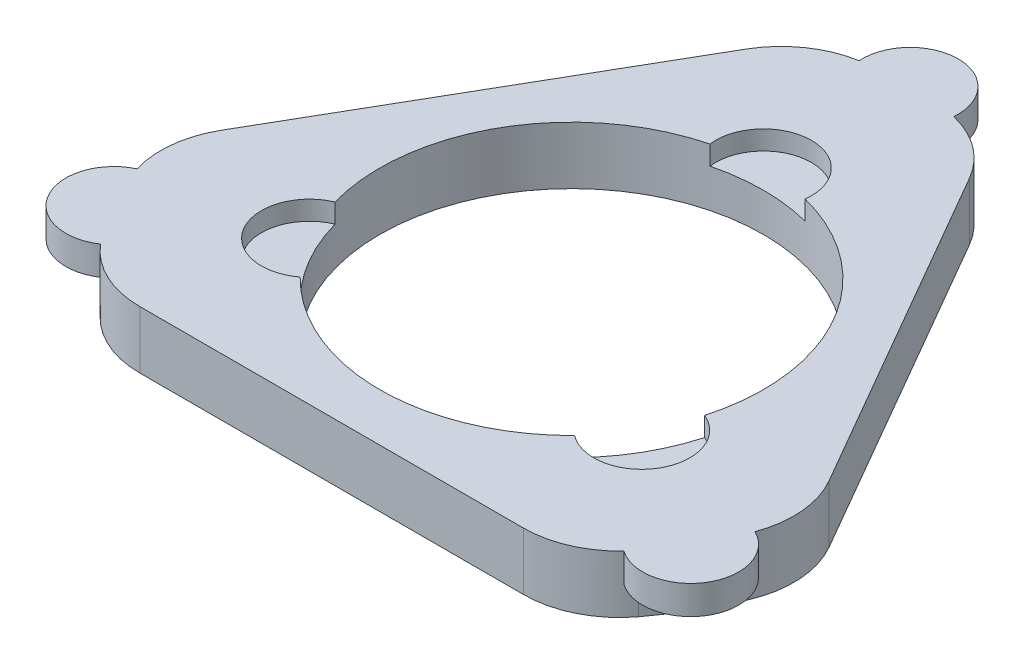
ISO-10303-21;
HEADER;
FILE_DESCRIPTION(('STEP AP214'),'2;1');
FILE_NAME('part.step','',(''),(''),'','','');
FILE_SCHEMA(('AUTOMOTIVE_DESIGN { 1 0 10303 214 1 1 1 1 }'));
ENDSEC;
DATA;
#1=APPLICATION_CONTEXT('core data for automotive mechanical design processes');
#2=APPLICATION_PROTOCOL_DEFINITION('international standard','automotive_design',2000,#1);
#3=PRODUCT_CONTEXT('',#1,'mechanical');
#4=PRODUCT('Part','Part','',(#3));
#5=PRODUCT_RELATED_PRODUCT_CATEGORY('part','',(#4));
#6=PRODUCT_DEFINITION_FORMATION('','',#4);
#7=PRODUCT_DEFINITION_CONTEXT('part definition',#1,'design');
#8=PRODUCT_DEFINITION('design','',#6,#7);
#9=PRODUCT_DEFINITION_SHAPE('','',#8);
#10=(LENGTH_UNIT() NAMED_UNIT(*) SI_UNIT(.MILLI.,.METRE.));
#11=(NAMED_UNIT(*) PLANE_ANGLE_UNIT() SI_UNIT($,.RADIAN.));
#12=(NAMED_UNIT(*) SI_UNIT($,.STERADIAN.) SOLID_ANGLE_UNIT());
#13=UNCERTAINTY_MEASURE_WITH_UNIT(LENGTH_MEASURE(1.E-05),#10,'distance_accuracy_value','');
#14=(GEOMETRIC_REPRESENTATION_CONTEXT(3) GLOBAL_UNCERTAINTY_ASSIGNED_CONTEXT((#13)) GLOBAL_UNIT_ASSIGNED_CONTEXT((#10,
#11,#12)) REPRESENTATION_CONTEXT('',''));
#15=CARTESIAN_POINT('',(0.,0.,0.));
#16=DIRECTION('',(0.,0.,1.));
#17=DIRECTION('',(1.,0.,0.));
#18=AXIS2_PLACEMENT_3D('',#15,#16,#17);
#19=CARTESIAN_POINT('',(0.,6.,0.));
#20=DIRECTION('',(0.,1.,0.));
#21=DIRECTION('',(0.,0.,1.));
#22=AXIS2_PLACEMENT_3D('',#19,#20,#21);
#23=PLANE('',#22);
#24=CARTESIAN_POINT('',(0.,6.,-20.));
#25=DIRECTION('',(0.,1.,0.));
#26=DIRECTION('',(0.,0.,1.));
#27=AXIS2_PLACEMENT_3D('',#24,#25,#26);
#28=CIRCLE('',#27,5.);
#29=CARTESIAN_POINT('',(4.96078370824611,6.,-19.375));
#30=VERTEX_POINT('',#29);
#31=CARTESIAN_POINT('',(-4.96078370824611,6.,-19.375));
#32=VERTEX_POINT('',#31);
#33=EDGE_CURVE('E201',#30,#32,#28,.T.);
#34=ORIENTED_EDGE('',*,*,#33,.F.);
#35=CARTESIAN_POINT('',(0.,6.,0.));
#36=DIRECTION('',(0.,1.,0.));
#37=DIRECTION('',(0.,0.,1.));
#38=AXIS2_PLACEMENT_3D('',#35,#36,#37);
#39=CIRCLE('',#38,20.);
#40=CARTESIAN_POINT('',(19.2596340524469,6.,5.39133528597775));
#41=VERTEX_POINT('',#40);
#42=EDGE_CURVE('E214',#41,#30,#39,.T.);
#43=ORIENTED_EDGE('',*,*,#42,.F.);
#44=CARTESIAN_POINT('',(17.3205080756901,6.,9.99999999999925));
#45=DIRECTION('',(0.,1.,0.));
#46=DIRECTION('',(0.,0.,1.));
#47=AXIS2_PLACEMENT_3D('',#44,#45,#46);
#48=CIRCLE('',#47,5.);
#49=CARTESIAN_POINT('',(14.2988503442014,6.,13.9836647140201));
#50=VERTEX_POINT('',#49);
#51=EDGE_CURVE('E234',#50,#41,#48,.T.);
#52=ORIENTED_EDGE('',*,*,#51,.F.);
#53=CARTESIAN_POINT('',(-14.2988503441995,6.,13.9836647140221));
#54=VERTEX_POINT('',#53);
#55=EDGE_CURVE('E273',#54,#50,#39,.T.);
#56=ORIENTED_EDGE('',*,*,#55,.F.);
#57=CARTESIAN_POINT('',(-17.3205080756875,6.,10.0000000000007));
#58=DIRECTION('',(0.,1.,0.));
#59=DIRECTION('',(0.,0.,1.));
#60=AXIS2_PLACEMENT_3D('',#57,#58,#59);
#61=CIRCLE('',#60,5.);
#62=CARTESIAN_POINT('',(-19.2596340524462,6.,5.39133528598004));
#63=VERTEX_POINT('',#62);
#64=EDGE_CURVE('E222',#63,#54,#61,.T.);
#65=ORIENTED_EDGE('',*,*,#64,.F.);
#66=EDGE_CURVE('E276',#32,#63,#39,.T.);
#67=ORIENTED_EDGE('',*,*,#66,.F.);
#68=EDGE_LOOP('',(#34,#43,#52,#56,#65,#67));
#69=FACE_BOUND('',#68,.T.);
#70=CARTESIAN_POINT('',(-30.4536294819663,6.,17.2504043829445));
#71=DIRECTION('',(0.,1.,0.));
#72=DIRECTION('',(0.,0.,1.));
#73=AXIS2_PLACEMENT_3D('',#70,#71,#72);
#74=CIRCLE('',#73,5.);
#75=CARTESIAN_POINT('',(-32.5618339352836,6.,12.7165898760405));
#76=VERTEX_POINT('',#75);
#77=CARTESIAN_POINT('',(-27.6767457832055,6.,21.4083987219927));
#78=VERTEX_POINT('',#77);
#79=EDGE_CURVE('E256',#76,#78,#74,.T.);
#80=ORIENTED_EDGE('',*,*,#79,.T.);
#81=CARTESIAN_POINT('',(-20.,6.,15.));
#82=DIRECTION('',(0.,1.,0.));
#83=DIRECTION('',(0.,0.,1.));
#84=AXIS2_PLACEMENT_3D('',#81,#82,#83);
#85=CIRCLE('',#84,10.);
#86=CARTESIAN_POINT('',(-20.,6.,25.));
#87=VERTEX_POINT('',#86);
#88=EDGE_CURVE('E343',#78,#87,#85,.T.);
#89=ORIENTED_EDGE('',*,*,#88,.T.);
#90=DIRECTION('',(1.,0.,0.));
#91=VECTOR('',#90,1.);
#92=CARTESIAN_POINT('',(-43.301270189222,6.,25.));
#93=LINE('',#92,#91);
#94=CARTESIAN_POINT('',(20.,6.,25.));
#95=VERTEX_POINT('',#94);
#96=EDGE_CURVE('E245',#87,#95,#93,.T.);
#97=ORIENTED_EDGE('',*,*,#96,.T.);
#98=CARTESIAN_POINT('',(20.,6.,15.));
#99=DIRECTION('',(0.,1.,0.));
#100=DIRECTION('',(0.,0.,1.));
#101=AXIS2_PLACEMENT_3D('',#98,#99,#100);
#102=CIRCLE('',#101,10.);
#103=CARTESIAN_POINT('',(27.2938068498009,6.,21.8410804437455));
#104=VERTEX_POINT('',#103);
#105=EDGE_CURVE('E337',#95,#104,#102,.T.);
#106=ORIENTED_EDGE('',*,*,#105,.T.);
#107=CARTESIAN_POINT('',(30.1661031621676,6.,17.7484145773493));
#108=DIRECTION('',(0.,1.,0.));
#109=DIRECTION('',(0.,0.,1.));
#110=AXIS2_PLACEMENT_3D('',#107,#108,#109);
#111=CIRCLE('',#110,5.);
#112=CARTESIAN_POINT('',(32.3785900391947,6.,13.2645655813434));
#113=VERTEX_POINT('',#112);
#114=EDGE_CURVE('E252',#104,#113,#111,.T.);
#115=ORIENTED_EDGE('',*,*,#114,.T.);
#116=CARTESIAN_POINT('',(22.9903810567666,6.,9.82050807568875));
#117=DIRECTION('',(0.,1.,0.));
#118=DIRECTION('',(0.,0.,1.));
#119=AXIS2_PLACEMENT_3D('',#116,#117,#118);
#120=CIRCLE('',#119,10.);
#121=CARTESIAN_POINT('',(31.650635094611,6.,4.82050807568876));
#122=VERTEX_POINT('',#121);
#123=EDGE_CURVE('E335',#113,#122,#120,.T.);
#124=ORIENTED_EDGE('',*,*,#123,.T.);
#125=DIRECTION('',(-0.5,0.,-0.866025403784438));
#126=VECTOR('',#125,1.);
#127=CARTESIAN_POINT('',(43.301270189222,6.,25.));
#128=LINE('',#127,#126);
#129=CARTESIAN_POINT('',(11.650635094611,6.,-29.8205080756888));
#130=VERTEX_POINT('',#129);
#131=EDGE_CURVE('E216',#122,#130,#128,.T.);
#132=ORIENTED_EDGE('',*,*,#131,.T.);
#133=CARTESIAN_POINT('',(2.9903810567666,6.,-24.8205080756888));
#134=DIRECTION('',(0.,1.,0.));
#135=DIRECTION('',(0.,0.,1.));
#136=AXIS2_PLACEMENT_3D('',#133,#134,#135);
#137=CIRCLE('',#136,10.);
#138=CARTESIAN_POINT('',(5.26802708548266,6.,-34.5576703197861));
#139=VERTEX_POINT('',#138);
#140=EDGE_CURVE('E332',#130,#139,#137,.T.);
#141=ORIENTED_EDGE('',*,*,#140,.T.);
#142=CARTESIAN_POINT('',(0.287526319798734,6.,-34.9988189602938));
#143=DIRECTION('',(0.,1.,0.));
#144=DIRECTION('',(0.,0.,1.));
#145=AXIS2_PLACEMENT_3D('',#142,#143,#144);
#146=CIRCLE('',#145,5.);
#147=CARTESIAN_POINT('',(-4.70184425598925,6.,-34.6729643033361));
#148=VERTEX_POINT('',#147);
#149=EDGE_CURVE('E251',#139,#148,#146,.T.);
#150=ORIENTED_EDGE('',*,*,#149,.T.);
#151=CARTESIAN_POINT('',(-2.99038105676657,6.,-24.8205080756888));
#152=DIRECTION('',(0.,1.,0.));
#153=DIRECTION('',(0.,0.,1.));
#154=AXIS2_PLACEMENT_3D('',#151,#152,#153);
#155=CIRCLE('',#154,10.);
#156=CARTESIAN_POINT('',(-11.650635094611,6.,-29.8205080756888));
#157=VERTEX_POINT('',#156);
#158=EDGE_CURVE('E330',#148,#157,#155,.T.);
#159=ORIENTED_EDGE('',*,*,#158,.T.);
#160=DIRECTION('',(-0.5,0.,0.866025403784438));
#161=VECTOR('',#160,1.);
#162=CARTESIAN_POINT('',(0.,6.,-50.));
#163=LINE('',#162,#161);
#164=CARTESIAN_POINT('',(-31.650635094611,6.,4.82050807568876));
#165=VERTEX_POINT('',#164);
#166=EDGE_CURVE('E242',#157,#165,#163,.T.);
#167=ORIENTED_EDGE('',*,*,#166,.T.);
#168=CARTESIAN_POINT('',(-22.9903810567666,6.,9.82050807568877));
#169=DIRECTION('',(0.,1.,0.));
#170=DIRECTION('',(0.,0.,1.));
#171=AXIS2_PLACEMENT_3D('',#168,#169,#170);
#172=CIRCLE('',#171,10.);
#173=EDGE_CURVE('E340',#165,#76,#172,.T.);
#174=ORIENTED_EDGE('',*,*,#173,.T.);
#175=EDGE_LOOP('',(#80,#89,#97,#106,#115,#124,#132,#141,#150,#159,#167,#174));
#176=FACE_BOUND('',#175,.T.);
#177=ADVANCED_FACE('F37',(#69,#176),#23,.T.);
#178=CARTESIAN_POINT('',(0.,6.,0.));
#179=DIRECTION('',(0.,-1.,0.));
#180=DIRECTION('',(0.,0.,-1.));
#181=AXIS2_PLACEMENT_3D('',#178,#179,#180);
#182=CYLINDRICAL_SURFACE('',#181,35.);
#183=CARTESIAN_POINT('',(0.,3.,0.));
#184=DIRECTION('',(0.,1.,0.));
#185=DIRECTION('',(0.,0.,1.));
#186=AXIS2_PLACEMENT_3D('',#183,#184,#185);
#187=CIRCLE('',#186,35.);
#188=CARTESIAN_POINT('',(28.,3.,21.));
#189=VERTEX_POINT('',#188);
#190=CARTESIAN_POINT('',(32.1865334794732,3.,13.7487113059643));
#191=VERTEX_POINT('',#190);
#192=EDGE_CURVE('E294',#189,#191,#187,.T.);
#193=ORIENTED_EDGE('',*,*,#192,.F.);
#194=DIRECTION('',(0.,-1.,0.));
#195=VECTOR('',#194,1.);
#196=CARTESIAN_POINT('',(28.,6.,21.));
#197=LINE('',#196,#195);
#198=CARTESIAN_POINT('',(28.,0.,21.));
#199=VERTEX_POINT('',#198);
#200=EDGE_CURVE('E353',#189,#199,#197,.T.);
#201=ORIENTED_EDGE('',*,*,#200,.T.);
#202=CARTESIAN_POINT('',(0.,0.,0.));
#203=DIRECTION('',(0.,1.,0.));
#204=DIRECTION('',(0.,0.,1.));
#205=AXIS2_PLACEMENT_3D('',#202,#203,#204);
#206=CIRCLE('',#205,35.);
#207=CARTESIAN_POINT('',(32.1865334794732,0.,13.7487113059643));
#208=VERTEX_POINT('',#207);
#209=EDGE_CURVE('E280',#199,#208,#206,.T.);
#210=ORIENTED_EDGE('',*,*,#209,.T.);
#211=DIRECTION('',(0.,-1.,0.));
#212=VECTOR('',#211,1.);
#213=CARTESIAN_POINT('',(32.1865334794732,6.,13.7487113059643));
#214=LINE('',#213,#212);
#215=EDGE_CURVE('E351',#208,#191,#214,.F.);
#216=ORIENTED_EDGE('',*,*,#215,.T.);
#217=EDGE_LOOP('',(#193,#201,#210,#216));
#218=FACE_BOUND('',#217,.T.);
#219=ADVANCED_FACE('F442',(#218),#182,.T.);
#220=CARTESIAN_POINT('',(0.,3.,0.));
#221=DIRECTION('',(0.,1.,0.));
#222=DIRECTION('',(0.,0.,1.));
#223=AXIS2_PLACEMENT_3D('',#220,#221,#222);
#224=CIRCLE('',#223,35.);
#225=CARTESIAN_POINT('',(4.18653347947323,3.,-34.7487113059643));
#226=VERTEX_POINT('',#225);
#227=CARTESIAN_POINT('',(-4.1865334794732,3.,-34.7487113059643));
#228=VERTEX_POINT('',#227);
#229=EDGE_CURVE('E291',#226,#228,#224,.T.);
#230=ORIENTED_EDGE('',*,*,#229,.F.);
#231=DIRECTION('',(0.,-1.,0.));
#232=VECTOR('',#231,1.);
#233=CARTESIAN_POINT('',(4.18653347947323,6.,-34.7487113059643));
#234=LINE('',#233,#232);
#235=CARTESIAN_POINT('',(4.18653347947323,0.,-34.7487113059643));
#236=VERTEX_POINT('',#235);
#237=EDGE_CURVE('E363',#226,#236,#234,.T.);
#238=ORIENTED_EDGE('',*,*,#237,.T.);
#239=CARTESIAN_POINT('',(-4.1865334794732,0.,-34.7487113059643));
#240=VERTEX_POINT('',#239);
#241=EDGE_CURVE('E277',#236,#240,#206,.T.);
#242=ORIENTED_EDGE('',*,*,#241,.T.);
#243=DIRECTION('',(0.,-1.,0.));
#244=VECTOR('',#243,1.);
#245=CARTESIAN_POINT('',(-4.1865334794732,6.,-34.7487113059643));
#246=LINE('',#245,#244);
#247=EDGE_CURVE('E361',#240,#228,#246,.F.);
#248=ORIENTED_EDGE('',*,*,#247,.T.);
#249=EDGE_LOOP('',(#230,#238,#242,#248));
#250=FACE_BOUND('',#249,.T.);
#251=ADVANCED_FACE('F410',(#250),#182,.T.);
#252=CARTESIAN_POINT('',(-32.1865334794732,0.,13.7487113059643));
#253=VERTEX_POINT('',#252);
#254=CARTESIAN_POINT('',(-28.,0.,21.));
#255=VERTEX_POINT('',#254);
#256=EDGE_CURVE('E281',#253,#255,#206,.T.);
#257=ORIENTED_EDGE('',*,*,#256,.T.);
#258=DIRECTION('',(0.,-1.,0.));
#259=VECTOR('',#258,1.);
#260=CARTESIAN_POINT('',(-28.,6.,21.));
#261=LINE('',#260,#259);
#262=CARTESIAN_POINT('',(-28.,3.,21.));
#263=VERTEX_POINT('',#262);
#264=EDGE_CURVE('E328',#255,#263,#261,.F.);
#265=ORIENTED_EDGE('',*,*,#264,.T.);
#266=CARTESIAN_POINT('',(0.,3.,0.));
#267=DIRECTION('',(0.,1.,0.));
#268=DIRECTION('',(0.,0.,1.));
#269=AXIS2_PLACEMENT_3D('',#266,#267,#268);
#270=CIRCLE('',#269,35.);
#271=CARTESIAN_POINT('',(-32.1865334794732,3.,13.7487113059643));
#272=VERTEX_POINT('',#271);
#273=EDGE_CURVE('E288',#272,#263,#270,.T.);
#274=ORIENTED_EDGE('',*,*,#273,.F.);
#275=DIRECTION('',(0.,-1.,0.));
#276=VECTOR('',#275,1.);
#277=CARTESIAN_POINT('',(-32.1865334794732,6.,13.7487113059643));
#278=LINE('',#277,#276);
#279=EDGE_CURVE('E326',#272,#253,#278,.T.);
#280=ORIENTED_EDGE('',*,*,#279,.T.);
#281=EDGE_LOOP('',(#257,#265,#274,#280));
#282=FACE_BOUND('',#281,.T.);
#283=ADVANCED_FACE('F466',(#282),#182,.T.);
#284=CARTESIAN_POINT('',(0.,0.,0.));
#285=DIRECTION('',(0.,1.,0.));
#286=DIRECTION('',(0.,0.,1.));
#287=AXIS2_PLACEMENT_3D('',#284,#285,#286);
#288=PLANE('',#287);
#289=CARTESIAN_POINT('',(-24.5085189270996,0.,14.15));
#290=DIRECTION('',(0.,1.,0.));
#291=DIRECTION('',(0.,0.,1.));
#292=AXIS2_PLACEMENT_3D('',#289,#290,#291);
#293=CIRCLE('',#292,2.9);
#294=CARTESIAN_POINT('',(-24.5085189270996,0.,17.05));
#295=VERTEX_POINT('',#294);
#296=EDGE_CURVE('E272',#295,#295,#293,.T.);
#297=ORIENTED_EDGE('',*,*,#296,.T.);
#298=EDGE_LOOP('',(#297));
#299=FACE_BOUND('',#298,.T.);
#300=CARTESIAN_POINT('',(24.5085189270996,0.,14.15));
#301=DIRECTION('',(0.,1.,0.));
#302=DIRECTION('',(0.,0.,1.));
#303=AXIS2_PLACEMENT_3D('',#300,#301,#302);
#304=CIRCLE('',#303,2.9);
#305=CARTESIAN_POINT('',(24.5085189270996,0.,17.05));
#306=VERTEX_POINT('',#305);
#307=EDGE_CURVE('E268',#306,#306,#304,.T.);
#308=ORIENTED_EDGE('',*,*,#307,.T.);
#309=EDGE_LOOP('',(#308));
#310=FACE_BOUND('',#309,.T.);
#311=CARTESIAN_POINT('',(0.,0.,-28.3));
#312=DIRECTION('',(0.,1.,0.));
#313=DIRECTION('',(0.,0.,1.));
#314=AXIS2_PLACEMENT_3D('',#311,#312,#313);
#315=CIRCLE('',#314,2.9);
#316=CARTESIAN_POINT('',(0.,0.,-25.4));
#317=VERTEX_POINT('',#316);
#318=EDGE_CURVE('E264',#317,#317,#315,.T.);
#319=ORIENTED_EDGE('',*,*,#318,.T.);
#320=EDGE_LOOP('',(#319));
#321=FACE_BOUND('',#320,.T.);
#322=CARTESIAN_POINT('',(0.,0.,0.));
#323=DIRECTION('',(0.,1.,0.));
#324=DIRECTION('',(0.,0.,1.));
#325=AXIS2_PLACEMENT_3D('',#322,#323,#324);
#326=CIRCLE('',#325,20.);
#327=CARTESIAN_POINT('',(0.,0.,20.));
#328=VERTEX_POINT('',#327);
#329=EDGE_CURVE('E248',#328,#328,#326,.T.);
#330=ORIENTED_EDGE('',*,*,#329,.T.);
#331=EDGE_LOOP('',(#330));
#332=FACE_BOUND('',#331,.T.);
#333=DIRECTION('',(1.,0.,0.));
#334=VECTOR('',#333,1.);
#335=CARTESIAN_POINT('',(0.,0.,25.));
#336=LINE('',#335,#334);
#337=CARTESIAN_POINT('',(-20.,0.,25.));
#338=VERTEX_POINT('',#337);
#339=CARTESIAN_POINT('',(20.,0.,25.));
#340=VERTEX_POINT('',#339);
#341=EDGE_CURVE('E302',#338,#340,#336,.T.);
#342=ORIENTED_EDGE('',*,*,#341,.F.);
#343=CARTESIAN_POINT('',(-20.,0.,15.));
#344=DIRECTION('',(0.,1.,0.));
#345=DIRECTION('',(0.,0.,1.));
#346=AXIS2_PLACEMENT_3D('',#343,#344,#345);
#347=CIRCLE('',#346,10.);
#348=EDGE_CURVE('E324',#338,#255,#347,.F.);
#349=ORIENTED_EDGE('',*,*,#348,.T.);
#350=ORIENTED_EDGE('',*,*,#256,.F.);
#351=CARTESIAN_POINT('',(-22.9903810567666,0.,9.82050807568877));
#352=DIRECTION('',(0.,1.,0.));
#353=DIRECTION('',(0.,0.,1.));
#354=AXIS2_PLACEMENT_3D('',#351,#352,#353);
#355=CIRCLE('',#354,10.);
#356=CARTESIAN_POINT('',(-31.650635094611,0.,4.82050807568878));
#357=VERTEX_POINT('',#356);
#358=EDGE_CURVE('E322',#253,#357,#355,.F.);
#359=ORIENTED_EDGE('',*,*,#358,.T.);
#360=DIRECTION('',(-0.5,0.,0.866025403784439));
#361=VECTOR('',#360,1.);
#362=CARTESIAN_POINT('',(-21.650635094611,0.,-12.5));
#363=LINE('',#362,#361);
#364=CARTESIAN_POINT('',(-11.650635094611,0.,-29.8205080756888));
#365=VERTEX_POINT('',#364);
#366=EDGE_CURVE('E297',#365,#357,#363,.T.);
#367=ORIENTED_EDGE('',*,*,#366,.F.);
#368=CARTESIAN_POINT('',(-2.99038105676657,0.,-24.8205080756888));
#369=DIRECTION('',(0.,1.,0.));
#370=DIRECTION('',(0.,0.,1.));
#371=AXIS2_PLACEMENT_3D('',#368,#369,#370);
#372=CIRCLE('',#371,10.);
#373=EDGE_CURVE('E314',#365,#240,#372,.F.);
#374=ORIENTED_EDGE('',*,*,#373,.T.);
#375=ORIENTED_EDGE('',*,*,#241,.F.);
#376=CARTESIAN_POINT('',(2.9903810567666,0.,-24.8205080756888));
#377=DIRECTION('',(0.,1.,0.));
#378=DIRECTION('',(0.,0.,1.));
#379=AXIS2_PLACEMENT_3D('',#376,#377,#378);
#380=CIRCLE('',#379,10.);
#381=CARTESIAN_POINT('',(11.650635094611,0.,-29.8205080756888));
#382=VERTEX_POINT('',#381);
#383=EDGE_CURVE('E316',#236,#382,#380,.F.);
#384=ORIENTED_EDGE('',*,*,#383,.T.);
#385=DIRECTION('',(-0.5,0.,-0.866025403784439));
#386=VECTOR('',#385,1.);
#387=CARTESIAN_POINT('',(21.650635094611,0.,-12.5));
#388=LINE('',#387,#386);
#389=CARTESIAN_POINT('',(31.650635094611,0.,4.82050807568876));
#390=VERTEX_POINT('',#389);
#391=EDGE_CURVE('E305',#390,#382,#388,.T.);
#392=ORIENTED_EDGE('',*,*,#391,.F.);
#393=CARTESIAN_POINT('',(22.9903810567666,0.,9.82050807568875));
#394=DIRECTION('',(0.,1.,0.));
#395=DIRECTION('',(0.,0.,1.));
#396=AXIS2_PLACEMENT_3D('',#393,#394,#395);
#397=CIRCLE('',#396,10.);
#398=EDGE_CURVE('E318',#390,#208,#397,.F.);
#399=ORIENTED_EDGE('',*,*,#398,.T.);
#400=ORIENTED_EDGE('',*,*,#209,.F.);
#401=CARTESIAN_POINT('',(20.,0.,15.));
#402=DIRECTION('',(0.,1.,0.));
#403=DIRECTION('',(0.,0.,1.));
#404=AXIS2_PLACEMENT_3D('',#401,#402,#403);
#405=CIRCLE('',#404,10.);
#406=EDGE_CURVE('E320',#199,#340,#405,.F.);
#407=ORIENTED_EDGE('',*,*,#406,.T.);
#408=EDGE_LOOP('',(#342,#349,#350,#359,#367,#374,#375,#384,#392,#399,#400,#407));
#409=FACE_BOUND('',#408,.T.);
#410=ADVANCED_FACE('F419',(#299,#310,#321,#332,#409),#288,.F.);
#411=CARTESIAN_POINT('',(0.,6.,0.));
#412=DIRECTION('',(0.,-1.,0.));
#413=DIRECTION('',(0.,0.,-1.));
#414=AXIS2_PLACEMENT_3D('',#411,#412,#413);
#415=CYLINDRICAL_SURFACE('',#414,20.);
#416=DIRECTION('',(0.,1.,0.));
#417=VECTOR('',#416,1.);
#418=CARTESIAN_POINT('',(4.96078370824611,4.,-19.375));
#419=LINE('',#418,#417);
#420=CARTESIAN_POINT('',(4.96078370824611,4.,-19.375));
#421=VERTEX_POINT('',#420);
#422=EDGE_CURVE('E205',#421,#30,#419,.T.);
#423=ORIENTED_EDGE('',*,*,#422,.F.);
#424=CARTESIAN_POINT('',(0.,4.,0.));
#425=DIRECTION('',(0.,1.,0.));
#426=DIRECTION('',(0.,0.,1.));
#427=AXIS2_PLACEMENT_3D('',#424,#425,#426);
#428=CIRCLE('',#427,20.);
#429=CARTESIAN_POINT('',(-4.96078370824611,4.,-19.375));
#430=VERTEX_POINT('',#429);
#431=EDGE_CURVE('E196',#430,#421,#428,.F.);
#432=ORIENTED_EDGE('',*,*,#431,.F.);
#433=DIRECTION('',(0.,1.,0.));
#434=VECTOR('',#433,1.);
#435=CARTESIAN_POINT('',(-4.96078370824611,4.,-19.375));
#436=LINE('',#435,#434);
#437=EDGE_CURVE('E207',#430,#32,#436,.T.);
#438=ORIENTED_EDGE('',*,*,#437,.T.);
#439=ORIENTED_EDGE('',*,*,#66,.T.);
#440=DIRECTION('',(0.,1.,0.));
#441=VECTOR('',#440,1.);
#442=CARTESIAN_POINT('',(-19.2596340524462,4.,5.39133528598004));
#443=LINE('',#442,#441);
#444=CARTESIAN_POINT('',(-19.2596340524462,4.,5.39133528598004));
#445=VERTEX_POINT('',#444);
#446=EDGE_CURVE('E224',#445,#63,#443,.T.);
#447=ORIENTED_EDGE('',*,*,#446,.F.);
#448=CARTESIAN_POINT('',(0.,4.,0.));
#449=DIRECTION('',(0.,1.,0.));
#450=DIRECTION('',(0.,0.,1.));
#451=AXIS2_PLACEMENT_3D('',#448,#449,#450);
#452=CIRCLE('',#451,20.);
#453=CARTESIAN_POINT('',(-14.2988503441995,4.,13.9836647140221));
#454=VERTEX_POINT('',#453);
#455=EDGE_CURVE('E220',#454,#445,#452,.F.);
#456=ORIENTED_EDGE('',*,*,#455,.F.);
#457=DIRECTION('',(0.,1.,0.));
#458=VECTOR('',#457,1.);
#459=CARTESIAN_POINT('',(-14.2988503441995,4.,13.9836647140221));
#460=LINE('',#459,#458);
#461=EDGE_CURVE('E227',#454,#54,#460,.T.);
#462=ORIENTED_EDGE('',*,*,#461,.T.);
#463=ORIENTED_EDGE('',*,*,#55,.T.);
#464=DIRECTION('',(0.,1.,0.));
#465=VECTOR('',#464,1.);
#466=CARTESIAN_POINT('',(14.2988503442014,4.,13.9836647140201));
#467=LINE('',#466,#465);
#468=CARTESIAN_POINT('',(14.2988503442014,4.,13.9836647140201));
#469=VERTEX_POINT('',#468);
#470=EDGE_CURVE('E236',#469,#50,#467,.T.);
#471=ORIENTED_EDGE('',*,*,#470,.F.);
#472=CARTESIAN_POINT('',(0.,4.,0.));
#473=DIRECTION('',(0.,1.,0.));
#474=DIRECTION('',(0.,0.,1.));
#475=AXIS2_PLACEMENT_3D('',#472,#473,#474);
#476=CIRCLE('',#475,20.);
#477=CARTESIAN_POINT('',(19.2596340524469,4.,5.39133528597775));
#478=VERTEX_POINT('',#477);
#479=EDGE_CURVE('E231',#478,#469,#476,.F.);
#480=ORIENTED_EDGE('',*,*,#479,.F.);
#481=DIRECTION('',(0.,1.,0.));
#482=VECTOR('',#481,1.);
#483=CARTESIAN_POINT('',(19.2596340524469,4.,5.39133528597775));
#484=LINE('',#483,#482);
#485=EDGE_CURVE('E226',#478,#41,#484,.T.);
#486=ORIENTED_EDGE('',*,*,#485,.T.);
#487=ORIENTED_EDGE('',*,*,#42,.T.);
#488=EDGE_LOOP('',(#423,#432,#438,#439,#447,#456,#462,#463,#471,#480,#486,#487));
#489=FACE_BOUND('',#488,.T.);
#490=ORIENTED_EDGE('',*,*,#329,.F.);
#491=EDGE_LOOP('',(#490));
#492=FACE_BOUND('',#491,.T.);
#493=ADVANCED_FACE('F210',(#489,#492),#415,.F.);
#494=CARTESIAN_POINT('',(-24.5085189270996,-2.,14.15));
#495=DIRECTION('',(0.,-1.,0.));
#496=DIRECTION('',(0.,0.,-1.));
#497=AXIS2_PLACEMENT_3D('',#494,#495,#496);
#498=PLANE('',#497);
#499=CARTESIAN_POINT('',(-24.5085189270996,-2.,14.15));
#500=DIRECTION('',(0.,-1.,0.));
#501=DIRECTION('',(0.,0.,-1.));
#502=AXIS2_PLACEMENT_3D('',#499,#500,#501);
#503=CIRCLE('',#502,2.9);
#504=CARTESIAN_POINT('',(-24.5085189270996,-2.,11.25));
#505=VERTEX_POINT('',#504);
#506=EDGE_CURVE('E269',#505,#505,#503,.T.);
#507=ORIENTED_EDGE('',*,*,#506,.T.);
#508=EDGE_LOOP('',(#507));
#509=FACE_BOUND('',#508,.T.);
#510=ADVANCED_FACE('F565',(#509),#498,.T.);
#511=CARTESIAN_POINT('',(-24.5085189270996,14.202438661764,14.15));
#512=DIRECTION('',(0.,-1.,0.));
#513=DIRECTION('',(0.,0.,-1.));
#514=AXIS2_PLACEMENT_3D('',#511,#512,#513);
#515=CYLINDRICAL_SURFACE('',#514,2.9);
#516=ORIENTED_EDGE('',*,*,#506,.F.);
#517=EDGE_LOOP('',(#516));
#518=FACE_BOUND('',#517,.T.);
#519=ORIENTED_EDGE('',*,*,#296,.F.);
#520=EDGE_LOOP('',(#519));
#521=FACE_BOUND('',#520,.T.);
#522=ADVANCED_FACE('F560',(#518,#521),#515,.T.);
#523=CARTESIAN_POINT('',(24.5085189270996,-2.,14.15));
#524=DIRECTION('',(0.,-1.,0.));
#525=DIRECTION('',(0.,0.,-1.));
#526=AXIS2_PLACEMENT_3D('',#523,#524,#525);
#527=PLANE('',#526);
#528=CARTESIAN_POINT('',(24.5085189270996,-2.,14.15));
#529=DIRECTION('',(0.,-1.,0.));
#530=DIRECTION('',(0.,0.,-1.));
#531=AXIS2_PLACEMENT_3D('',#528,#529,#530);
#532=CIRCLE('',#531,2.9);
#533=CARTESIAN_POINT('',(24.5085189270996,-2.,11.25));
#534=VERTEX_POINT('',#533);
#535=EDGE_CURVE('E265',#534,#534,#532,.T.);
#536=ORIENTED_EDGE('',*,*,#535,.T.);
#537=EDGE_LOOP('',(#536));
#538=FACE_BOUND('',#537,.T.);
#539=ADVANCED_FACE('F557',(#538),#527,.T.);
#540=CARTESIAN_POINT('',(24.5085189270996,14.202438661764,14.15));
#541=DIRECTION('',(0.,-1.,0.));
#542=DIRECTION('',(0.,0.,-1.));
#543=AXIS2_PLACEMENT_3D('',#540,#541,#542);
#544=CYLINDRICAL_SURFACE('',#543,2.9);
#545=ORIENTED_EDGE('',*,*,#535,.F.);
#546=EDGE_LOOP('',(#545));
#547=FACE_BOUND('',#546,.T.);
#548=ORIENTED_EDGE('',*,*,#307,.F.);
#549=EDGE_LOOP('',(#548));
#550=FACE_BOUND('',#549,.T.);
#551=ADVANCED_FACE('F552',(#547,#550),#544,.T.);
#552=CARTESIAN_POINT('',(0.,-2.,-28.3));
#553=DIRECTION('',(0.,-1.,0.));
#554=DIRECTION('',(0.,0.,-1.));
#555=AXIS2_PLACEMENT_3D('',#552,#553,#554);
#556=PLANE('',#555);
#557=CARTESIAN_POINT('',(0.,-2.,-28.3));
#558=DIRECTION('',(0.,-1.,0.));
#559=DIRECTION('',(0.,0.,-1.));
#560=AXIS2_PLACEMENT_3D('',#557,#558,#559);
#561=CIRCLE('',#560,2.9);
#562=CARTESIAN_POINT('',(0.,-2.,-31.2));
#563=VERTEX_POINT('',#562);
#564=EDGE_CURVE('E260',#563,#563,#561,.T.);
#565=ORIENTED_EDGE('',*,*,#564,.T.);
#566=EDGE_LOOP('',(#565));
#567=FACE_BOUND('',#566,.T.);
#568=ADVANCED_FACE('F549',(#567),#556,.T.);
#569=CARTESIAN_POINT('',(0.,14.202438661764,-28.3));
#570=DIRECTION('',(0.,-1.,0.));
#571=DIRECTION('',(0.,0.,-1.));
#572=AXIS2_PLACEMENT_3D('',#569,#570,#571);
#573=CYLINDRICAL_SURFACE('',#572,2.9);
#574=ORIENTED_EDGE('',*,*,#564,.F.);
#575=EDGE_LOOP('',(#574));
#576=FACE_BOUND('',#575,.T.);
#577=ORIENTED_EDGE('',*,*,#318,.F.);
#578=EDGE_LOOP('',(#577));
#579=FACE_BOUND('',#578,.T.);
#580=ADVANCED_FACE('F547',(#576,#579),#573,.T.);
#581=CARTESIAN_POINT('',(-30.4536294819663,3.,17.2504043829445));
#582=DIRECTION('',(0.,1.,0.));
#583=DIRECTION('',(0.,0.,1.));
#584=AXIS2_PLACEMENT_3D('',#581,#582,#583);
#585=CYLINDRICAL_SURFACE('',#584,5.);
#586=ORIENTED_EDGE('',*,*,#79,.F.);
#587=DIRECTION('',(0.,1.,0.));
#588=VECTOR('',#587,1.);
#589=CARTESIAN_POINT('',(-32.5618339352836,6.,12.7165898760405));
#590=LINE('',#589,#588);
#591=CARTESIAN_POINT('',(-32.5618339352836,3.,12.7165898760405));
#592=VERTEX_POINT('',#591);
#593=EDGE_CURVE('E371',#76,#592,#590,.F.);
#594=ORIENTED_EDGE('',*,*,#593,.T.);
#595=CARTESIAN_POINT('',(-30.4536294819663,3.,17.2504043829445));
#596=DIRECTION('',(0.,1.,0.));
#597=DIRECTION('',(0.,0.,1.));
#598=AXIS2_PLACEMENT_3D('',#595,#596,#597);
#599=CIRCLE('',#598,5.);
#600=CARTESIAN_POINT('',(-27.6767457832055,3.,21.4083987219927));
#601=VERTEX_POINT('',#600);
#602=EDGE_CURVE('E258',#592,#601,#599,.T.);
#603=ORIENTED_EDGE('',*,*,#602,.T.);
#604=DIRECTION('',(0.,1.,0.));
#605=VECTOR('',#604,1.);
#606=CARTESIAN_POINT('',(-27.6767457832055,3.,21.4083987219927));
#607=LINE('',#606,#605);
#608=EDGE_CURVE('E368',#601,#78,#607,.T.);
#609=ORIENTED_EDGE('',*,*,#608,.T.);
#610=EDGE_LOOP('',(#586,#594,#603,#609));
#611=FACE_BOUND('',#610,.T.);
#612=ADVANCED_FACE('F543',(#611),#585,.T.);
#613=CARTESIAN_POINT('',(-30.4536294819663,3.,17.2504043829445));
#614=DIRECTION('',(0.,1.,0.));
#615=DIRECTION('',(0.,0.,1.));
#616=AXIS2_PLACEMENT_3D('',#613,#614,#615);
#617=PLANE('',#616);
#618=ORIENTED_EDGE('',*,*,#602,.F.);
#619=CARTESIAN_POINT('',(-22.9903810567666,3.,9.82050807568877));
#620=DIRECTION('',(0.,1.,0.));
#621=DIRECTION('',(0.,0.,1.));
#622=AXIS2_PLACEMENT_3D('',#619,#620,#621);
#623=CIRCLE('',#622,10.);
#624=EDGE_CURVE('E374',#592,#272,#623,.T.);
#625=ORIENTED_EDGE('',*,*,#624,.T.);
#626=ORIENTED_EDGE('',*,*,#273,.T.);
#627=CARTESIAN_POINT('',(-20.,3.,15.));
#628=DIRECTION('',(0.,1.,0.));
#629=DIRECTION('',(0.,0.,1.));
#630=AXIS2_PLACEMENT_3D('',#627,#628,#629);
#631=CIRCLE('',#630,10.);
#632=EDGE_CURVE('E365',#263,#601,#631,.T.);
#633=ORIENTED_EDGE('',*,*,#632,.T.);
#634=EDGE_LOOP('',(#618,#625,#626,#633));
#635=FACE_BOUND('',#634,.T.);
#636=ADVANCED_FACE('F540',(#635),#617,.F.);
#637=CARTESIAN_POINT('',(0.287526319798734,3.,-34.9988189602938));
#638=DIRECTION('',(0.,1.,0.));
#639=DIRECTION('',(0.,0.,1.));
#640=AXIS2_PLACEMENT_3D('',#637,#638,#639);
#641=CYLINDRICAL_SURFACE('',#640,5.);
#642=ORIENTED_EDGE('',*,*,#149,.F.);
#643=DIRECTION('',(0.,1.,0.));
#644=VECTOR('',#643,1.);
#645=CARTESIAN_POINT('',(5.26802708548266,6.,-34.5576703197861));
#646=LINE('',#645,#644);
#647=CARTESIAN_POINT('',(5.26802708548266,3.,-34.5576703197861));
#648=VERTEX_POINT('',#647);
#649=EDGE_CURVE('E387',#139,#648,#646,.F.);
#650=ORIENTED_EDGE('',*,*,#649,.T.);
#651=CARTESIAN_POINT('',(0.287526319798734,3.,-34.9988189602938));
#652=DIRECTION('',(0.,1.,0.));
#653=DIRECTION('',(0.,0.,1.));
#654=AXIS2_PLACEMENT_3D('',#651,#652,#653);
#655=CIRCLE('',#654,5.);
#656=CARTESIAN_POINT('',(-4.70184425598925,3.,-34.6729643033361));
#657=VERTEX_POINT('',#656);
#658=EDGE_CURVE('E254',#648,#657,#655,.T.);
#659=ORIENTED_EDGE('',*,*,#658,.T.);
#660=DIRECTION('',(0.,1.,0.));
#661=VECTOR('',#660,1.);
#662=CARTESIAN_POINT('',(-4.70184425598925,3.,-34.6729643033361));
#663=LINE('',#662,#661);
#664=EDGE_CURVE('E11',#657,#148,#663,.T.);
#665=ORIENTED_EDGE('',*,*,#664,.T.);
#666=EDGE_LOOP('',(#642,#650,#659,#665));
#667=FACE_BOUND('',#666,.T.);
#668=ADVANCED_FACE('F402',(#667),#641,.T.);
#669=CARTESIAN_POINT('',(0.287526319798734,3.,-34.9988189602938));
#670=DIRECTION('',(0.,1.,0.));
#671=DIRECTION('',(0.,0.,1.));
#672=AXIS2_PLACEMENT_3D('',#669,#670,#671);
#673=PLANE('',#672);
#674=ORIENTED_EDGE('',*,*,#658,.F.);
#675=CARTESIAN_POINT('',(2.9903810567666,3.,-24.8205080756888));
#676=DIRECTION('',(0.,1.,0.));
#677=DIRECTION('',(0.,0.,1.));
#678=AXIS2_PLACEMENT_3D('',#675,#676,#677);
#679=CIRCLE('',#678,10.);
#680=EDGE_CURVE('E390',#648,#226,#679,.T.);
#681=ORIENTED_EDGE('',*,*,#680,.T.);
#682=ORIENTED_EDGE('',*,*,#229,.T.);
#683=CARTESIAN_POINT('',(-2.99038105676657,3.,-24.8205080756888));
#684=DIRECTION('',(0.,1.,0.));
#685=DIRECTION('',(0.,0.,1.));
#686=AXIS2_PLACEMENT_3D('',#683,#684,#685);
#687=CIRCLE('',#686,10.);
#688=EDGE_CURVE('E45',#228,#657,#687,.T.);
#689=ORIENTED_EDGE('',*,*,#688,.T.);
#690=EDGE_LOOP('',(#674,#681,#682,#689));
#691=FACE_BOUND('',#690,.T.);
#692=ADVANCED_FACE('F395',(#691),#673,.F.);
#693=CARTESIAN_POINT('',(30.1661031621676,3.,17.7484145773493));
#694=DIRECTION('',(0.,1.,0.));
#695=DIRECTION('',(0.,0.,1.));
#696=AXIS2_PLACEMENT_3D('',#693,#694,#695);
#697=CYLINDRICAL_SURFACE('',#696,5.);
#698=ORIENTED_EDGE('',*,*,#114,.F.);
#699=DIRECTION('',(0.,1.,0.));
#700=VECTOR('',#699,1.);
#701=CARTESIAN_POINT('',(27.2938068498009,6.,21.8410804437455));
#702=LINE('',#701,#700);
#703=CARTESIAN_POINT('',(27.2938068498009,3.,21.8410804437455));
#704=VERTEX_POINT('',#703);
#705=EDGE_CURVE('E376',#104,#704,#702,.F.);
#706=ORIENTED_EDGE('',*,*,#705,.T.);
#707=CARTESIAN_POINT('',(30.1661031621676,3.,17.7484145773493));
#708=DIRECTION('',(0.,1.,0.));
#709=DIRECTION('',(0.,0.,1.));
#710=AXIS2_PLACEMENT_3D('',#707,#708,#709);
#711=CIRCLE('',#710,5.);
#712=CARTESIAN_POINT('',(32.3785900391947,3.,13.2645655813434));
#713=VERTEX_POINT('',#712);
#714=EDGE_CURVE('E249',#704,#713,#711,.T.);
#715=ORIENTED_EDGE('',*,*,#714,.T.);
#716=DIRECTION('',(0.,1.,0.));
#717=VECTOR('',#716,1.);
#718=CARTESIAN_POINT('',(32.3785900391947,3.,13.2645655813434));
#719=LINE('',#718,#717);
#720=EDGE_CURVE('E384',#713,#113,#719,.T.);
#721=ORIENTED_EDGE('',*,*,#720,.T.);
#722=EDGE_LOOP('',(#698,#706,#715,#721));
#723=FACE_BOUND('',#722,.T.);
#724=ADVANCED_FACE('F532',(#723),#697,.T.);
#725=CARTESIAN_POINT('',(30.1661031621676,3.,17.7484145773493));
#726=DIRECTION('',(0.,1.,0.));
#727=DIRECTION('',(0.,0.,1.));
#728=AXIS2_PLACEMENT_3D('',#725,#726,#727);
#729=PLANE('',#728);
#730=ORIENTED_EDGE('',*,*,#714,.F.);
#731=CARTESIAN_POINT('',(20.,3.,15.));
#732=DIRECTION('',(0.,1.,0.));
#733=DIRECTION('',(0.,0.,1.));
#734=AXIS2_PLACEMENT_3D('',#731,#732,#733);
#735=CIRCLE('',#734,10.);
#736=EDGE_CURVE('E379',#704,#189,#735,.T.);
#737=ORIENTED_EDGE('',*,*,#736,.T.);
#738=ORIENTED_EDGE('',*,*,#192,.T.);
#739=CARTESIAN_POINT('',(22.9903810567666,3.,9.82050807568875));
#740=DIRECTION('',(0.,1.,0.));
#741=DIRECTION('',(0.,0.,1.));
#742=AXIS2_PLACEMENT_3D('',#739,#740,#741);
#743=CIRCLE('',#742,10.);
#744=EDGE_CURVE('E381',#191,#713,#743,.T.);
#745=ORIENTED_EDGE('',*,*,#744,.T.);
#746=EDGE_LOOP('',(#730,#737,#738,#745));
#747=FACE_BOUND('',#746,.T.);
#748=ADVANCED_FACE('F449',(#747),#729,.F.);
#749=CARTESIAN_POINT('',(0.,-16.,-50.));
#750=DIRECTION('',(-0.866025403784439,0.,-0.5));
#751=DIRECTION('',(-0.5,0.,0.866025403784439));
#752=AXIS2_PLACEMENT_3D('',#749,#750,#751);
#753=PLANE('',#752);
#754=ORIENTED_EDGE('',*,*,#366,.T.);
#755=DIRECTION('',(0.,1.,0.));
#756=VECTOR('',#755,1.);
#757=CARTESIAN_POINT('',(-31.650635094611,6.,4.82050807568877));
#758=LINE('',#757,#756);
#759=EDGE_CURVE('E348',#357,#165,#758,.T.);
#760=ORIENTED_EDGE('',*,*,#759,.T.);
#761=ORIENTED_EDGE('',*,*,#166,.F.);
#762=DIRECTION('',(0.,1.,0.));
#763=VECTOR('',#762,1.);
#764=CARTESIAN_POINT('',(-11.650635094611,0.,-29.8205080756888));
#765=LINE('',#764,#763);
#766=EDGE_CURVE('E345',#157,#365,#765,.F.);
#767=ORIENTED_EDGE('',*,*,#766,.T.);
#768=EDGE_LOOP('',(#754,#760,#761,#767));
#769=FACE_BOUND('',#768,.T.);
#770=ADVANCED_FACE('F416',(#769),#753,.T.);
#771=CARTESIAN_POINT('',(-43.301270189222,-16.,25.));
#772=DIRECTION('',(0.,0.,1.));
#773=DIRECTION('',(1.,0.,0.));
#774=AXIS2_PLACEMENT_3D('',#771,#772,#773);
#775=PLANE('',#774);
#776=ORIENTED_EDGE('',*,*,#96,.F.);
#777=DIRECTION('',(0.,1.,0.));
#778=VECTOR('',#777,1.);
#779=CARTESIAN_POINT('',(-20.,0.,25.));
#780=LINE('',#779,#778);
#781=EDGE_CURVE('E311',#87,#338,#780,.F.);
#782=ORIENTED_EDGE('',*,*,#781,.T.);
#783=ORIENTED_EDGE('',*,*,#341,.T.);
#784=DIRECTION('',(0.,1.,0.));
#785=VECTOR('',#784,1.);
#786=CARTESIAN_POINT('',(20.,6.,25.));
#787=LINE('',#786,#785);
#788=EDGE_CURVE('E308',#340,#95,#787,.T.);
#789=ORIENTED_EDGE('',*,*,#788,.T.);
#790=EDGE_LOOP('',(#776,#782,#783,#789));
#791=FACE_BOUND('',#790,.T.);
#792=ADVANCED_FACE('F457',(#791),#775,.T.);
#793=CARTESIAN_POINT('',(43.301270189222,-16.,25.));
#794=DIRECTION('',(0.866025403784439,0.,-0.5));
#795=DIRECTION('',(-0.5,0.,-0.866025403784439));
#796=AXIS2_PLACEMENT_3D('',#793,#794,#795);
#797=PLANE('',#796);
#798=ORIENTED_EDGE('',*,*,#131,.F.);
#799=DIRECTION('',(0.,1.,0.));
#800=VECTOR('',#799,1.);
#801=CARTESIAN_POINT('',(31.650635094611,0.,4.82050807568875));
#802=LINE('',#801,#800);
#803=EDGE_CURVE('E358',#122,#390,#802,.F.);
#804=ORIENTED_EDGE('',*,*,#803,.T.);
#805=ORIENTED_EDGE('',*,*,#391,.T.);
#806=DIRECTION('',(0.,1.,0.));
#807=VECTOR('',#806,1.);
#808=CARTESIAN_POINT('',(11.650635094611,6.,-29.8205080756888));
#809=LINE('',#808,#807);
#810=EDGE_CURVE('E355',#382,#130,#809,.T.);
#811=ORIENTED_EDGE('',*,*,#810,.T.);
#812=EDGE_LOOP('',(#798,#804,#805,#811));
#813=FACE_BOUND('',#812,.T.);
#814=ADVANCED_FACE('F432',(#813),#797,.T.);
#815=CARTESIAN_POINT('',(-20.,6.,15.));
#816=DIRECTION('',(0.,-1.,0.));
#817=DIRECTION('',(0.,0.,-1.));
#818=AXIS2_PLACEMENT_3D('',#815,#816,#817);
#819=CYLINDRICAL_SURFACE('',#818,10.);
#820=ORIENTED_EDGE('',*,*,#632,.F.);
#821=ORIENTED_EDGE('',*,*,#264,.F.);
#822=ORIENTED_EDGE('',*,*,#348,.F.);
#823=ORIENTED_EDGE('',*,*,#781,.F.);
#824=ORIENTED_EDGE('',*,*,#88,.F.);
#825=ORIENTED_EDGE('',*,*,#608,.F.);
#826=EDGE_LOOP('',(#820,#821,#822,#823,#824,#825));
#827=FACE_BOUND('',#826,.T.);
#828=ADVANCED_FACE('F462',(#827),#819,.T.);
#829=CARTESIAN_POINT('',(-22.9903810567666,6.,9.82050807568877));
#830=DIRECTION('',(0.,-1.,0.));
#831=DIRECTION('',(0.,0.,-1.));
#832=AXIS2_PLACEMENT_3D('',#829,#830,#831);
#833=CYLINDRICAL_SURFACE('',#832,10.);
#834=ORIENTED_EDGE('',*,*,#358,.F.);
#835=ORIENTED_EDGE('',*,*,#279,.F.);
#836=ORIENTED_EDGE('',*,*,#624,.F.);
#837=ORIENTED_EDGE('',*,*,#593,.F.);
#838=ORIENTED_EDGE('',*,*,#173,.F.);
#839=ORIENTED_EDGE('',*,*,#759,.F.);
#840=EDGE_LOOP('',(#834,#835,#836,#837,#838,#839));
#841=FACE_BOUND('',#840,.T.);
#842=ADVANCED_FACE('F425',(#841),#833,.T.);
#843=CARTESIAN_POINT('',(20.,6.,15.));
#844=DIRECTION('',(0.,-1.,0.));
#845=DIRECTION('',(0.,0.,-1.));
#846=AXIS2_PLACEMENT_3D('',#843,#844,#845);
#847=CYLINDRICAL_SURFACE('',#846,10.);
#848=ORIENTED_EDGE('',*,*,#406,.F.);
#849=ORIENTED_EDGE('',*,*,#200,.F.);
#850=ORIENTED_EDGE('',*,*,#736,.F.);
#851=ORIENTED_EDGE('',*,*,#705,.F.);
#852=ORIENTED_EDGE('',*,*,#105,.F.);
#853=ORIENTED_EDGE('',*,*,#788,.F.);
#854=EDGE_LOOP('',(#848,#849,#850,#851,#852,#853));
#855=FACE_BOUND('',#854,.T.);
#856=ADVANCED_FACE('F452',(#855),#847,.T.);
#857=CARTESIAN_POINT('',(22.9903810567666,6.,9.82050807568875));
#858=DIRECTION('',(0.,-1.,0.));
#859=DIRECTION('',(0.,0.,-1.));
#860=AXIS2_PLACEMENT_3D('',#857,#858,#859);
#861=CYLINDRICAL_SURFACE('',#860,10.);
#862=ORIENTED_EDGE('',*,*,#744,.F.);
#863=ORIENTED_EDGE('',*,*,#215,.F.);
#864=ORIENTED_EDGE('',*,*,#398,.F.);
#865=ORIENTED_EDGE('',*,*,#803,.F.);
#866=ORIENTED_EDGE('',*,*,#123,.F.);
#867=ORIENTED_EDGE('',*,*,#720,.F.);
#868=EDGE_LOOP('',(#862,#863,#864,#865,#866,#867));
#869=FACE_BOUND('',#868,.T.);
#870=ADVANCED_FACE('F445',(#869),#861,.T.);
#871=CARTESIAN_POINT('',(2.9903810567666,6.,-24.8205080756888));
#872=DIRECTION('',(0.,-1.,0.));
#873=DIRECTION('',(0.,0.,-1.));
#874=AXIS2_PLACEMENT_3D('',#871,#872,#873);
#875=CYLINDRICAL_SURFACE('',#874,10.);
#876=ORIENTED_EDGE('',*,*,#383,.F.);
#877=ORIENTED_EDGE('',*,*,#237,.F.);
#878=ORIENTED_EDGE('',*,*,#680,.F.);
#879=ORIENTED_EDGE('',*,*,#649,.F.);
#880=ORIENTED_EDGE('',*,*,#140,.F.);
#881=ORIENTED_EDGE('',*,*,#810,.F.);
#882=EDGE_LOOP('',(#876,#877,#878,#879,#880,#881));
#883=FACE_BOUND('',#882,.T.);
#884=ADVANCED_FACE('F408',(#883),#875,.T.);
#885=CARTESIAN_POINT('',(-2.99038105676657,6.,-24.8205080756888));
#886=DIRECTION('',(0.,-1.,0.));
#887=DIRECTION('',(0.,0.,-1.));
#888=AXIS2_PLACEMENT_3D('',#885,#886,#887);
#889=CYLINDRICAL_SURFACE('',#888,10.);
#890=ORIENTED_EDGE('',*,*,#688,.F.);
#891=ORIENTED_EDGE('',*,*,#247,.F.);
#892=ORIENTED_EDGE('',*,*,#373,.F.);
#893=ORIENTED_EDGE('',*,*,#766,.F.);
#894=ORIENTED_EDGE('',*,*,#158,.F.);
#895=ORIENTED_EDGE('',*,*,#664,.F.);
#896=EDGE_LOOP('',(#890,#891,#892,#893,#894,#895));
#897=FACE_BOUND('',#896,.T.);
#898=ADVANCED_FACE('F39',(#897),#889,.T.);
#899=CARTESIAN_POINT('',(17.3205080756901,4.,9.99999999999925));
#900=DIRECTION('',(0.,1.,0.));
#901=DIRECTION('',(0.,0.,1.));
#902=AXIS2_PLACEMENT_3D('',#899,#900,#901);
#903=CYLINDRICAL_SURFACE('',#902,5.);
#904=ORIENTED_EDGE('',*,*,#51,.T.);
#905=ORIENTED_EDGE('',*,*,#485,.F.);
#906=CARTESIAN_POINT('',(17.3205080756901,4.,9.99999999999925));
#907=DIRECTION('',(0.,1.,0.));
#908=DIRECTION('',(0.,0.,1.));
#909=AXIS2_PLACEMENT_3D('',#906,#907,#908);
#910=CIRCLE('',#909,5.);
#911=EDGE_CURVE('E233',#469,#478,#910,.T.);
#912=ORIENTED_EDGE('',*,*,#911,.F.);
#913=ORIENTED_EDGE('',*,*,#470,.T.);
#914=EDGE_LOOP('',(#904,#905,#912,#913));
#915=FACE_BOUND('',#914,.T.);
#916=ADVANCED_FACE('F512',(#915),#903,.F.);
#917=CARTESIAN_POINT('',(0.,4.,0.));
#918=DIRECTION('',(0.,1.,0.));
#919=DIRECTION('',(0.,0.,1.));
#920=AXIS2_PLACEMENT_3D('',#917,#918,#919);
#921=PLANE('',#920);
#922=ORIENTED_EDGE('',*,*,#479,.T.);
#923=ORIENTED_EDGE('',*,*,#911,.T.);
#924=EDGE_LOOP('',(#922,#923));
#925=FACE_BOUND('',#924,.T.);
#926=ADVANCED_FACE('F487',(#925),#921,.T.);
#927=CARTESIAN_POINT('',(-17.3205080756875,4.,10.0000000000007));
#928=DIRECTION('',(0.,1.,0.));
#929=DIRECTION('',(0.,0.,1.));
#930=AXIS2_PLACEMENT_3D('',#927,#928,#929);
#931=CYLINDRICAL_SURFACE('',#930,5.);
#932=ORIENTED_EDGE('',*,*,#64,.T.);
#933=ORIENTED_EDGE('',*,*,#461,.F.);
#934=CARTESIAN_POINT('',(-17.3205080756875,4.,10.0000000000007));
#935=DIRECTION('',(0.,1.,0.));
#936=DIRECTION('',(0.,0.,1.));
#937=AXIS2_PLACEMENT_3D('',#934,#935,#936);
#938=CIRCLE('',#937,5.);
#939=EDGE_CURVE('E58',#445,#454,#938,.T.);
#940=ORIENTED_EDGE('',*,*,#939,.F.);
#941=ORIENTED_EDGE('',*,*,#446,.T.);
#942=EDGE_LOOP('',(#932,#933,#940,#941));
#943=FACE_BOUND('',#942,.T.);
#944=ADVANCED_FACE('F477',(#943),#931,.F.);
#945=CARTESIAN_POINT('',(0.,4.,0.));
#946=DIRECTION('',(0.,1.,0.));
#947=DIRECTION('',(0.,0.,1.));
#948=AXIS2_PLACEMENT_3D('',#945,#946,#947);
#949=PLANE('',#948);
#950=ORIENTED_EDGE('',*,*,#455,.T.);
#951=ORIENTED_EDGE('',*,*,#939,.T.);
#952=EDGE_LOOP('',(#950,#951));
#953=FACE_BOUND('',#952,.T.);
#954=ADVANCED_FACE('F479',(#953),#949,.T.);
#955=CARTESIAN_POINT('',(0.,4.,-20.));
#956=DIRECTION('',(0.,1.,0.));
#957=DIRECTION('',(0.,0.,1.));
#958=AXIS2_PLACEMENT_3D('',#955,#956,#957);
#959=CYLINDRICAL_SURFACE('',#958,5.);
#960=ORIENTED_EDGE('',*,*,#33,.T.);
#961=ORIENTED_EDGE('',*,*,#437,.F.);
#962=CARTESIAN_POINT('',(0.,4.,-20.));
#963=DIRECTION('',(0.,1.,0.));
#964=DIRECTION('',(0.,0.,1.));
#965=AXIS2_PLACEMENT_3D('',#962,#963,#964);
#966=CIRCLE('',#965,5.);
#967=EDGE_CURVE('E51',#421,#430,#966,.T.);
#968=ORIENTED_EDGE('',*,*,#967,.F.);
#969=ORIENTED_EDGE('',*,*,#422,.T.);
#970=EDGE_LOOP('',(#960,#961,#968,#969));
#971=FACE_BOUND('',#970,.T.);
#972=ADVANCED_FACE('F204',(#971),#959,.F.);
#973=CARTESIAN_POINT('',(0.,4.,0.));
#974=DIRECTION('',(0.,1.,0.));
#975=DIRECTION('',(0.,0.,1.));
#976=AXIS2_PLACEMENT_3D('',#973,#974,#975);
#977=PLANE('',#976);
#978=ORIENTED_EDGE('',*,*,#431,.T.);
#979=ORIENTED_EDGE('',*,*,#967,.T.);
#980=EDGE_LOOP('',(#978,#979));
#981=FACE_BOUND('',#980,.T.);
#982=ADVANCED_FACE('F197',(#981),#977,.T.);
#983=CLOSED_SHELL('',(#177,#219,#251,#283,#410,#493,#510,#522,#539,#551,#568,#580,#612,#636,
#668,#692,#724,#748,#770,#792,#814,#828,#842,#856,#870,#884,#898,#916,#926,#944,#954,#972,#982));
#984=MANIFOLD_SOLID_BREP('B2',#983);
#985=ADVANCED_BREP_SHAPE_REPRESENTATION('',(#18,#984),#14);
#986=SHAPE_DEFINITION_REPRESENTATION(#9,#985);
ENDSEC;
END-ISO-10303-21;
